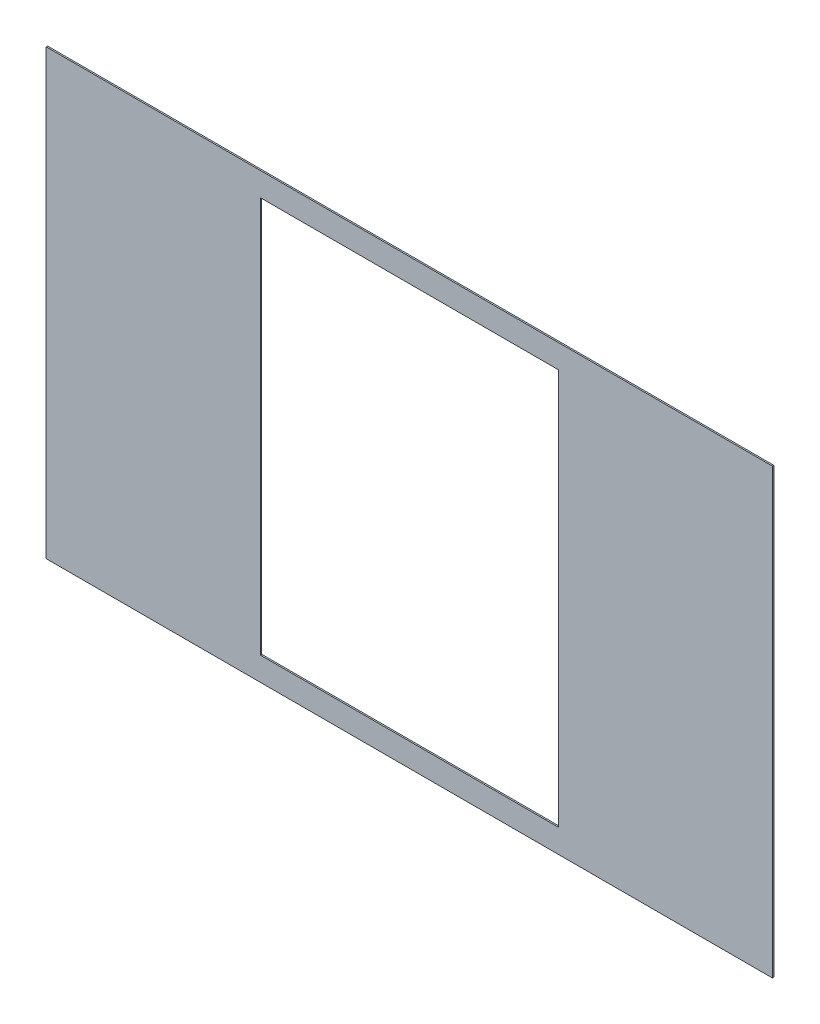
ISO-10303-21;
HEADER;
FILE_DESCRIPTION(('STEP AP214'),'2;1');
FILE_NAME('part.step','',(''),(''),'','','');
FILE_SCHEMA(('AUTOMOTIVE_DESIGN { 1 0 10303 214 1 1 1 1 }'));
ENDSEC;
DATA;
#1=APPLICATION_CONTEXT('core data for automotive mechanical design processes');
#2=APPLICATION_PROTOCOL_DEFINITION('international standard','automotive_design',2000,#1);
#3=PRODUCT_CONTEXT('',#1,'mechanical');
#4=PRODUCT('Part','Part','',(#3));
#5=PRODUCT_RELATED_PRODUCT_CATEGORY('part','',(#4));
#6=PRODUCT_DEFINITION_FORMATION('','',#4);
#7=PRODUCT_DEFINITION_CONTEXT('part definition',#1,'design');
#8=PRODUCT_DEFINITION('design','',#6,#7);
#9=PRODUCT_DEFINITION_SHAPE('','',#8);
#10=(LENGTH_UNIT() NAMED_UNIT(*) SI_UNIT(.MILLI.,.METRE.));
#11=(NAMED_UNIT(*) PLANE_ANGLE_UNIT() SI_UNIT($,.RADIAN.));
#12=(NAMED_UNIT(*) SI_UNIT($,.STERADIAN.) SOLID_ANGLE_UNIT());
#13=UNCERTAINTY_MEASURE_WITH_UNIT(LENGTH_MEASURE(1.E-05),#10,'distance_accuracy_value','');
#14=(GEOMETRIC_REPRESENTATION_CONTEXT(3) GLOBAL_UNCERTAINTY_ASSIGNED_CONTEXT((#13)) GLOBAL_UNIT_ASSIGNED_CONTEXT((#10,
#11,#12)) REPRESENTATION_CONTEXT('',''));
#15=CARTESIAN_POINT('',(0.,0.,0.));
#16=DIRECTION('',(0.,0.,1.));
#17=DIRECTION('',(1.,0.,0.));
#18=AXIS2_PLACEMENT_3D('',#15,#16,#17);
#19=CARTESIAN_POINT('',(-385.,235.,1.5));
#20=DIRECTION('',(1.,0.,0.));
#21=DIRECTION('',(0.,1.,0.));
#22=AXIS2_PLACEMENT_3D('',#19,#20,#21);
#23=PLANE('',#22);
#24=DIRECTION('',(0.,-1.,0.));
#25=VECTOR('',#24,1.);
#26=CARTESIAN_POINT('',(-385.,235.,0.));
#27=LINE('',#26,#25);
#28=CARTESIAN_POINT('',(-385.,235.,0.));
#29=VERTEX_POINT('',#28);
#30=CARTESIAN_POINT('',(-385.,-235.,0.));
#31=VERTEX_POINT('',#30);
#32=EDGE_CURVE('E132',#29,#31,#27,.T.);
#33=ORIENTED_EDGE('',*,*,#32,.T.);
#34=DIRECTION('',(0.,0.,-1.));
#35=VECTOR('',#34,1.);
#36=CARTESIAN_POINT('',(-385.,-235.,1.5));
#37=LINE('',#36,#35);
#38=CARTESIAN_POINT('',(-385.,-235.,1.5));
#39=VERTEX_POINT('',#38);
#40=EDGE_CURVE('E170',#39,#31,#37,.T.);
#41=ORIENTED_EDGE('',*,*,#40,.F.);
#42=DIRECTION('',(0.,-1.,0.));
#43=VECTOR('',#42,1.);
#44=CARTESIAN_POINT('',(-385.,235.,1.5));
#45=LINE('',#44,#43);
#46=CARTESIAN_POINT('',(-385.,235.,1.5));
#47=VERTEX_POINT('',#46);
#48=EDGE_CURVE('E133',#47,#39,#45,.T.);
#49=ORIENTED_EDGE('',*,*,#48,.F.);
#50=DIRECTION('',(0.,0.,-1.));
#51=VECTOR('',#50,1.);
#52=CARTESIAN_POINT('',(-385.,235.,1.5));
#53=LINE('',#52,#51);
#54=EDGE_CURVE('E147',#47,#29,#53,.T.);
#55=ORIENTED_EDGE('',*,*,#54,.T.);
#56=EDGE_LOOP('',(#33,#41,#49,#55));
#57=FACE_BOUND('',#56,.T.);
#58=ADVANCED_FACE('F39',(#57),#23,.F.);
#59=CARTESIAN_POINT('',(385.,-235.,1.5));
#60=DIRECTION('',(0.,1.,0.));
#61=DIRECTION('',(-1.,0.,0.));
#62=AXIS2_PLACEMENT_3D('',#59,#60,#61);
#63=PLANE('',#62);
#64=DIRECTION('',(1.,0.,0.));
#65=VECTOR('',#64,1.);
#66=CARTESIAN_POINT('',(385.,-235.,0.));
#67=LINE('',#66,#65);
#68=CARTESIAN_POINT('',(385.,-235.,0.));
#69=VERTEX_POINT('',#68);
#70=EDGE_CURVE('E151',#31,#69,#67,.T.);
#71=ORIENTED_EDGE('',*,*,#70,.T.);
#72=DIRECTION('',(0.,0.,-1.));
#73=VECTOR('',#72,1.);
#74=CARTESIAN_POINT('',(385.,-235.,1.5));
#75=LINE('',#74,#73);
#76=CARTESIAN_POINT('',(385.,-235.,1.5));
#77=VERTEX_POINT('',#76);
#78=EDGE_CURVE('E166',#77,#69,#75,.T.);
#79=ORIENTED_EDGE('',*,*,#78,.F.);
#80=DIRECTION('',(1.,0.,0.));
#81=VECTOR('',#80,1.);
#82=CARTESIAN_POINT('',(385.,-235.,1.5));
#83=LINE('',#82,#81);
#84=EDGE_CURVE('E137',#39,#77,#83,.T.);
#85=ORIENTED_EDGE('',*,*,#84,.F.);
#86=ORIENTED_EDGE('',*,*,#40,.T.);
#87=EDGE_LOOP('',(#71,#79,#85,#86));
#88=FACE_BOUND('',#87,.T.);
#89=ADVANCED_FACE('F206',(#88),#63,.F.);
#90=CARTESIAN_POINT('',(385.,235.,1.5));
#91=DIRECTION('',(-1.,0.,0.));
#92=DIRECTION('',(0.,0.,1.));
#93=AXIS2_PLACEMENT_3D('',#90,#91,#92);
#94=PLANE('',#93);
#95=DIRECTION('',(0.,1.,0.));
#96=VECTOR('',#95,1.);
#97=CARTESIAN_POINT('',(385.,235.,0.));
#98=LINE('',#97,#96);
#99=CARTESIAN_POINT('',(385.,235.,0.));
#100=VERTEX_POINT('',#99);
#101=EDGE_CURVE('E154',#69,#100,#98,.T.);
#102=ORIENTED_EDGE('',*,*,#101,.T.);
#103=DIRECTION('',(0.,0.,-1.));
#104=VECTOR('',#103,1.);
#105=CARTESIAN_POINT('',(385.,235.,1.5));
#106=LINE('',#105,#104);
#107=CARTESIAN_POINT('',(385.,235.,1.5));
#108=VERTEX_POINT('',#107);
#109=EDGE_CURVE('E162',#108,#100,#106,.T.);
#110=ORIENTED_EDGE('',*,*,#109,.F.);
#111=DIRECTION('',(0.,1.,0.));
#112=VECTOR('',#111,1.);
#113=CARTESIAN_POINT('',(385.,235.,1.5));
#114=LINE('',#113,#112);
#115=EDGE_CURVE('E141',#77,#108,#114,.T.);
#116=ORIENTED_EDGE('',*,*,#115,.F.);
#117=ORIENTED_EDGE('',*,*,#78,.T.);
#118=EDGE_LOOP('',(#102,#110,#116,#117));
#119=FACE_BOUND('',#118,.T.);
#120=ADVANCED_FACE('F211',(#119),#94,.F.);
#121=CARTESIAN_POINT('',(385.,235.,1.5));
#122=DIRECTION('',(0.,-1.,0.));
#123=DIRECTION('',(1.,0.,0.));
#124=AXIS2_PLACEMENT_3D('',#121,#122,#123);
#125=PLANE('',#124);
#126=DIRECTION('',(-1.,0.,0.));
#127=VECTOR('',#126,1.);
#128=CARTESIAN_POINT('',(385.,235.,0.));
#129=LINE('',#128,#127);
#130=EDGE_CURVE('E138',#100,#29,#129,.T.);
#131=ORIENTED_EDGE('',*,*,#130,.T.);
#132=ORIENTED_EDGE('',*,*,#54,.F.);
#133=DIRECTION('',(-1.,0.,0.));
#134=VECTOR('',#133,1.);
#135=CARTESIAN_POINT('',(385.,235.,1.5));
#136=LINE('',#135,#134);
#137=EDGE_CURVE('E144',#108,#47,#136,.T.);
#138=ORIENTED_EDGE('',*,*,#137,.F.);
#139=ORIENTED_EDGE('',*,*,#109,.T.);
#140=EDGE_LOOP('',(#131,#132,#138,#139));
#141=FACE_BOUND('',#140,.T.);
#142=ADVANCED_FACE('F224',(#141),#125,.F.);
#143=CARTESIAN_POINT('',(0.,0.,1.5));
#144=DIRECTION('',(0.,0.,-1.));
#145=DIRECTION('',(-1.,0.,0.));
#146=AXIS2_PLACEMENT_3D('',#143,#144,#145);
#147=PLANE('',#146);
#148=DIRECTION('',(-1.,0.,0.));
#149=VECTOR('',#148,1.);
#150=CARTESIAN_POINT('',(0.,-210.,1.5));
#151=LINE('',#150,#149);
#152=CARTESIAN_POINT('',(158.,-210.,1.5));
#153=VERTEX_POINT('',#152);
#154=CARTESIAN_POINT('',(-158.,-210.,1.5));
#155=VERTEX_POINT('',#154);
#156=EDGE_CURVE('E100',#153,#155,#151,.T.);
#157=ORIENTED_EDGE('',*,*,#156,.T.);
#158=DIRECTION('',(0.,1.,0.));
#159=VECTOR('',#158,1.);
#160=CARTESIAN_POINT('',(-158.,0.,1.5));
#161=LINE('',#160,#159);
#162=CARTESIAN_POINT('',(-158.,210.,1.5));
#163=VERTEX_POINT('',#162);
#164=EDGE_CURVE('E126',#155,#163,#161,.T.);
#165=ORIENTED_EDGE('',*,*,#164,.T.);
#166=DIRECTION('',(1.,0.,0.));
#167=VECTOR('',#166,1.);
#168=CARTESIAN_POINT('',(0.,210.,1.5));
#169=LINE('',#168,#167);
#170=CARTESIAN_POINT('',(158.,210.,1.5));
#171=VERTEX_POINT('',#170);
#172=EDGE_CURVE('E122',#163,#171,#169,.T.);
#173=ORIENTED_EDGE('',*,*,#172,.T.);
#174=DIRECTION('',(0.,-1.,0.));
#175=VECTOR('',#174,1.);
#176=CARTESIAN_POINT('',(158.,0.,1.5));
#177=LINE('',#176,#175);
#178=EDGE_CURVE('E106',#171,#153,#177,.T.);
#179=ORIENTED_EDGE('',*,*,#178,.T.);
#180=EDGE_LOOP('',(#157,#165,#173,#179));
#181=FACE_BOUND('',#180,.T.);
#182=ORIENTED_EDGE('',*,*,#48,.T.);
#183=ORIENTED_EDGE('',*,*,#84,.T.);
#184=ORIENTED_EDGE('',*,*,#115,.T.);
#185=ORIENTED_EDGE('',*,*,#137,.T.);
#186=EDGE_LOOP('',(#182,#183,#184,#185));
#187=FACE_BOUND('',#186,.T.);
#188=ADVANCED_FACE('F120',(#181,#187),#147,.F.);
#189=CARTESIAN_POINT('',(0.,0.,0.));
#190=DIRECTION('',(0.,0.,-1.));
#191=DIRECTION('',(-1.,0.,0.));
#192=AXIS2_PLACEMENT_3D('',#189,#190,#191);
#193=PLANE('',#192);
#194=DIRECTION('',(0.,1.,0.));
#195=VECTOR('',#194,1.);
#196=CARTESIAN_POINT('',(-158.,0.,0.));
#197=LINE('',#196,#195);
#198=CARTESIAN_POINT('',(-158.,-210.,0.));
#199=VERTEX_POINT('',#198);
#200=CARTESIAN_POINT('',(-158.,210.,0.));
#201=VERTEX_POINT('',#200);
#202=EDGE_CURVE('E11',#199,#201,#197,.T.);
#203=ORIENTED_EDGE('',*,*,#202,.F.);
#204=DIRECTION('',(-1.,0.,0.));
#205=VECTOR('',#204,1.);
#206=CARTESIAN_POINT('',(0.,-210.,0.));
#207=LINE('',#206,#205);
#208=CARTESIAN_POINT('',(158.,-210.,0.));
#209=VERTEX_POINT('',#208);
#210=EDGE_CURVE('E174',#209,#199,#207,.T.);
#211=ORIENTED_EDGE('',*,*,#210,.F.);
#212=DIRECTION('',(0.,-1.,0.));
#213=VECTOR('',#212,1.);
#214=CARTESIAN_POINT('',(158.,0.,0.));
#215=LINE('',#214,#213);
#216=CARTESIAN_POINT('',(158.,210.,0.));
#217=VERTEX_POINT('',#216);
#218=EDGE_CURVE('E114',#217,#209,#215,.T.);
#219=ORIENTED_EDGE('',*,*,#218,.F.);
#220=DIRECTION('',(1.,0.,0.));
#221=VECTOR('',#220,1.);
#222=CARTESIAN_POINT('',(0.,210.,0.));
#223=LINE('',#222,#221);
#224=EDGE_CURVE('E47',#201,#217,#223,.T.);
#225=ORIENTED_EDGE('',*,*,#224,.F.);
#226=EDGE_LOOP('',(#203,#211,#219,#225));
#227=FACE_BOUND('',#226,.T.);
#228=ORIENTED_EDGE('',*,*,#32,.F.);
#229=ORIENTED_EDGE('',*,*,#130,.F.);
#230=ORIENTED_EDGE('',*,*,#101,.F.);
#231=ORIENTED_EDGE('',*,*,#70,.F.);
#232=EDGE_LOOP('',(#228,#229,#230,#231));
#233=FACE_BOUND('',#232,.T.);
#234=ADVANCED_FACE('F188',(#227,#233),#193,.T.);
#235=CARTESIAN_POINT('',(-158.,210.,-8.5));
#236=DIRECTION('',(-1.,0.,0.));
#237=DIRECTION('',(0.,-1.,0.));
#238=AXIS2_PLACEMENT_3D('',#235,#236,#237);
#239=PLANE('',#238);
#240=DIRECTION('',(0.,0.,1.));
#241=VECTOR('',#240,1.);
#242=CARTESIAN_POINT('',(-158.,-210.,-8.5));
#243=LINE('',#242,#241);
#244=EDGE_CURVE('E54',#199,#155,#243,.T.);
#245=ORIENTED_EDGE('',*,*,#244,.F.);
#246=ORIENTED_EDGE('',*,*,#202,.T.);
#247=DIRECTION('',(0.,0.,1.));
#248=VECTOR('',#247,1.);
#249=CARTESIAN_POINT('',(-158.,210.,-8.5));
#250=LINE('',#249,#248);
#251=EDGE_CURVE('E107',#201,#163,#250,.T.);
#252=ORIENTED_EDGE('',*,*,#251,.T.);
#253=ORIENTED_EDGE('',*,*,#164,.F.);
#254=EDGE_LOOP('',(#245,#246,#252,#253));
#255=FACE_BOUND('',#254,.T.);
#256=ADVANCED_FACE('F191',(#255),#239,.F.);
#257=CARTESIAN_POINT('',(158.,210.,-8.5));
#258=DIRECTION('',(0.,1.,0.));
#259=DIRECTION('',(-1.,0.,0.));
#260=AXIS2_PLACEMENT_3D('',#257,#258,#259);
#261=PLANE('',#260);
#262=ORIENTED_EDGE('',*,*,#251,.F.);
#263=ORIENTED_EDGE('',*,*,#224,.T.);
#264=DIRECTION('',(0.,0.,1.));
#265=VECTOR('',#264,1.);
#266=CARTESIAN_POINT('',(158.,210.,-8.5));
#267=LINE('',#266,#265);
#268=EDGE_CURVE('E117',#217,#171,#267,.T.);
#269=ORIENTED_EDGE('',*,*,#268,.T.);
#270=ORIENTED_EDGE('',*,*,#172,.F.);
#271=EDGE_LOOP('',(#262,#263,#269,#270));
#272=FACE_BOUND('',#271,.T.);
#273=ADVANCED_FACE('F182',(#272),#261,.F.);
#274=CARTESIAN_POINT('',(158.,210.,-8.5));
#275=DIRECTION('',(1.,0.,0.));
#276=DIRECTION('',(0.,1.,0.));
#277=AXIS2_PLACEMENT_3D('',#274,#275,#276);
#278=PLANE('',#277);
#279=ORIENTED_EDGE('',*,*,#268,.F.);
#280=ORIENTED_EDGE('',*,*,#218,.T.);
#281=DIRECTION('',(0.,0.,1.));
#282=VECTOR('',#281,1.);
#283=CARTESIAN_POINT('',(158.,-210.,-8.5));
#284=LINE('',#283,#282);
#285=EDGE_CURVE('E59',#209,#153,#284,.T.);
#286=ORIENTED_EDGE('',*,*,#285,.T.);
#287=ORIENTED_EDGE('',*,*,#178,.F.);
#288=EDGE_LOOP('',(#279,#280,#286,#287));
#289=FACE_BOUND('',#288,.T.);
#290=ADVANCED_FACE('F111',(#289),#278,.F.);
#291=CARTESIAN_POINT('',(158.,-210.,-8.5));
#292=DIRECTION('',(0.,-1.,0.));
#293=DIRECTION('',(0.,0.,-1.));
#294=AXIS2_PLACEMENT_3D('',#291,#292,#293);
#295=PLANE('',#294);
#296=ORIENTED_EDGE('',*,*,#285,.F.);
#297=ORIENTED_EDGE('',*,*,#210,.T.);
#298=ORIENTED_EDGE('',*,*,#244,.T.);
#299=ORIENTED_EDGE('',*,*,#156,.F.);
#300=EDGE_LOOP('',(#296,#297,#298,#299));
#301=FACE_BOUND('',#300,.T.);
#302=ADVANCED_FACE('F101',(#301),#295,.F.);
#303=CLOSED_SHELL('',(#58,#89,#120,#142,#188,#234,#256,#273,#290,#302));
#304=MANIFOLD_SOLID_BREP('B2',#303);
#305=ADVANCED_BREP_SHAPE_REPRESENTATION('',(#18,#304),#14);
#306=SHAPE_DEFINITION_REPRESENTATION(#9,#305);
ENDSEC;
END-ISO-10303-21;
